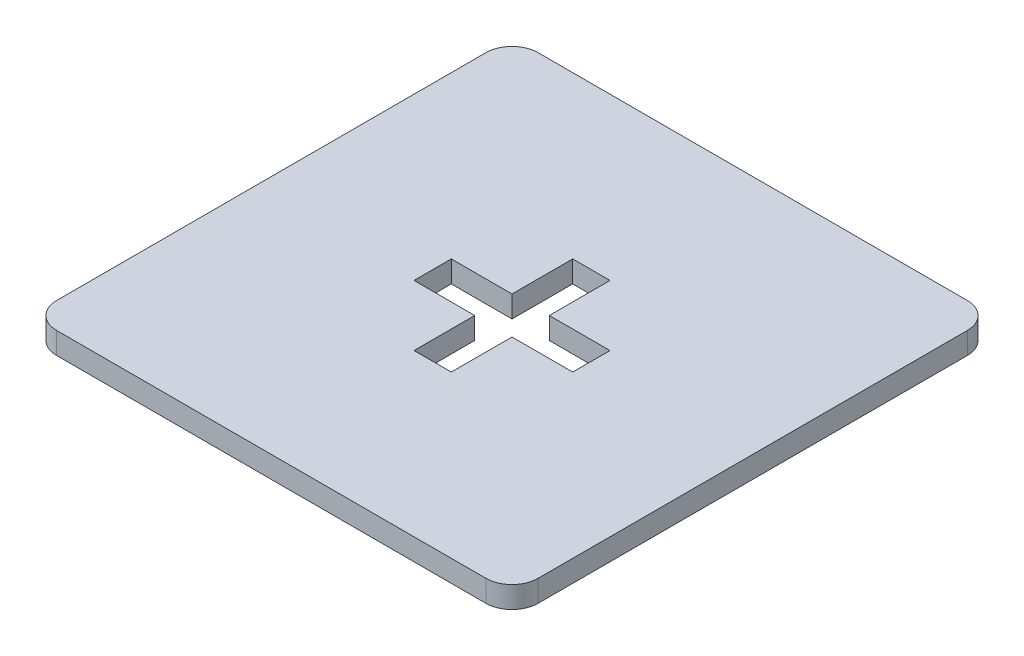
ISO-10303-21;
HEADER;
FILE_DESCRIPTION(('STEP AP214'),'2;1');
FILE_NAME('part.step','',(''),(''),'','','');
FILE_SCHEMA(('AUTOMOTIVE_DESIGN { 1 0 10303 214 1 1 1 1 }'));
ENDSEC;
DATA;
#1=APPLICATION_CONTEXT('core data for automotive mechanical design processes');
#2=APPLICATION_PROTOCOL_DEFINITION('international standard','automotive_design',2000,#1);
#3=PRODUCT_CONTEXT('',#1,'mechanical');
#4=PRODUCT('Part','Part','',(#3));
#5=PRODUCT_RELATED_PRODUCT_CATEGORY('part','',(#4));
#6=PRODUCT_DEFINITION_FORMATION('','',#4);
#7=PRODUCT_DEFINITION_CONTEXT('part definition',#1,'design');
#8=PRODUCT_DEFINITION('design','',#6,#7);
#9=PRODUCT_DEFINITION_SHAPE('','',#8);
#10=(LENGTH_UNIT() NAMED_UNIT(*) SI_UNIT(.MILLI.,.METRE.));
#11=(NAMED_UNIT(*) PLANE_ANGLE_UNIT() SI_UNIT($,.RADIAN.));
#12=(NAMED_UNIT(*) SI_UNIT($,.STERADIAN.) SOLID_ANGLE_UNIT());
#13=UNCERTAINTY_MEASURE_WITH_UNIT(LENGTH_MEASURE(1.E-05),#10,'distance_accuracy_value','');
#14=(GEOMETRIC_REPRESENTATION_CONTEXT(3) GLOBAL_UNCERTAINTY_ASSIGNED_CONTEXT((#13)) GLOBAL_UNIT_ASSIGNED_CONTEXT((#10,
#11,#12)) REPRESENTATION_CONTEXT('',''));
#15=CARTESIAN_POINT('',(0.,0.,0.));
#16=DIRECTION('',(0.,0.,1.));
#17=DIRECTION('',(1.,0.,0.));
#18=AXIS2_PLACEMENT_3D('',#15,#16,#17);
#19=CARTESIAN_POINT('',(24.75,2.5,24.75));
#20=DIRECTION('',(0.,-1.,0.));
#21=DIRECTION('',(0.,0.,-1.));
#22=AXIS2_PLACEMENT_3D('',#19,#20,#21);
#23=CYLINDRICAL_SURFACE('',#22,3.);
#24=DIRECTION('',(0.,-1.,0.));
#25=VECTOR('',#24,1.);
#26=CARTESIAN_POINT('',(27.75,2.5,24.75));
#27=LINE('',#26,#25);
#28=CARTESIAN_POINT('',(27.75,2.5,24.75));
#29=VERTEX_POINT('',#28);
#30=CARTESIAN_POINT('',(27.75,0.,24.75));
#31=VERTEX_POINT('',#30);
#32=EDGE_CURVE('E319',#29,#31,#27,.T.);
#33=ORIENTED_EDGE('',*,*,#32,.F.);
#34=CARTESIAN_POINT('',(24.75,2.5,24.75));
#35=DIRECTION('',(0.,1.,0.));
#36=DIRECTION('',(0.,0.,1.));
#37=AXIS2_PLACEMENT_3D('',#34,#35,#36);
#38=CIRCLE('',#37,3.);
#39=CARTESIAN_POINT('',(24.75,2.5,27.75));
#40=VERTEX_POINT('',#39);
#41=EDGE_CURVE('E42',#40,#29,#38,.T.);
#42=ORIENTED_EDGE('',*,*,#41,.F.);
#43=DIRECTION('',(0.,-1.,0.));
#44=VECTOR('',#43,1.);
#45=CARTESIAN_POINT('',(24.75,2.5,27.75));
#46=LINE('',#45,#44);
#47=CARTESIAN_POINT('',(24.75,0.,27.75));
#48=VERTEX_POINT('',#47);
#49=EDGE_CURVE('E322',#48,#40,#46,.F.);
#50=ORIENTED_EDGE('',*,*,#49,.F.);
#51=CARTESIAN_POINT('',(24.75,0.,24.75));
#52=DIRECTION('',(0.,1.,0.));
#53=DIRECTION('',(0.,0.,1.));
#54=AXIS2_PLACEMENT_3D('',#51,#52,#53);
#55=CIRCLE('',#54,3.);
#56=EDGE_CURVE('E11',#31,#48,#55,.F.);
#57=ORIENTED_EDGE('',*,*,#56,.F.);
#58=EDGE_LOOP('',(#33,#42,#50,#57));
#59=FACE_BOUND('',#58,.T.);
#60=ADVANCED_FACE('F35',(#59),#23,.T.);
#61=CARTESIAN_POINT('',(-24.75,2.5,24.75));
#62=DIRECTION('',(0.,-1.,0.));
#63=DIRECTION('',(0.,0.,-1.));
#64=AXIS2_PLACEMENT_3D('',#61,#62,#63);
#65=CYLINDRICAL_SURFACE('',#64,3.);
#66=DIRECTION('',(0.,-1.,0.));
#67=VECTOR('',#66,1.);
#68=CARTESIAN_POINT('',(-24.75,2.5,27.75));
#69=LINE('',#68,#67);
#70=CARTESIAN_POINT('',(-24.75,2.5,27.75));
#71=VERTEX_POINT('',#70);
#72=CARTESIAN_POINT('',(-24.75,0.,27.75));
#73=VERTEX_POINT('',#72);
#74=EDGE_CURVE('E309',#71,#73,#69,.T.);
#75=ORIENTED_EDGE('',*,*,#74,.F.);
#76=CARTESIAN_POINT('',(-24.75,2.5,24.75));
#77=DIRECTION('',(0.,1.,0.));
#78=DIRECTION('',(0.,0.,1.));
#79=AXIS2_PLACEMENT_3D('',#76,#77,#78);
#80=CIRCLE('',#79,3.);
#81=CARTESIAN_POINT('',(-27.75,2.5,24.75));
#82=VERTEX_POINT('',#81);
#83=EDGE_CURVE('E315',#82,#71,#80,.T.);
#84=ORIENTED_EDGE('',*,*,#83,.F.);
#85=DIRECTION('',(0.,-1.,0.));
#86=VECTOR('',#85,1.);
#87=CARTESIAN_POINT('',(-27.75,2.5,24.75));
#88=LINE('',#87,#86);
#89=CARTESIAN_POINT('',(-27.75,0.,24.75));
#90=VERTEX_POINT('',#89);
#91=EDGE_CURVE('E312',#90,#82,#88,.F.);
#92=ORIENTED_EDGE('',*,*,#91,.F.);
#93=CARTESIAN_POINT('',(-24.75,0.,24.75));
#94=DIRECTION('',(0.,1.,0.));
#95=DIRECTION('',(0.,0.,1.));
#96=AXIS2_PLACEMENT_3D('',#93,#94,#95);
#97=CIRCLE('',#96,3.);
#98=EDGE_CURVE('E317',#73,#90,#97,.F.);
#99=ORIENTED_EDGE('',*,*,#98,.F.);
#100=EDGE_LOOP('',(#75,#84,#92,#99));
#101=FACE_BOUND('',#100,.T.);
#102=ADVANCED_FACE('F354',(#101),#65,.T.);
#103=CARTESIAN_POINT('',(-24.75,2.5,-24.75));
#104=DIRECTION('',(0.,-1.,0.));
#105=DIRECTION('',(0.,0.,-1.));
#106=AXIS2_PLACEMENT_3D('',#103,#104,#105);
#107=CYLINDRICAL_SURFACE('',#106,3.);
#108=DIRECTION('',(0.,-1.,0.));
#109=VECTOR('',#108,1.);
#110=CARTESIAN_POINT('',(-27.75,2.5,-24.75));
#111=LINE('',#110,#109);
#112=CARTESIAN_POINT('',(-27.75,2.5,-24.75));
#113=VERTEX_POINT('',#112);
#114=CARTESIAN_POINT('',(-27.75,0.,-24.75));
#115=VERTEX_POINT('',#114);
#116=EDGE_CURVE('E299',#113,#115,#111,.T.);
#117=ORIENTED_EDGE('',*,*,#116,.F.);
#118=CARTESIAN_POINT('',(-24.75,2.5,-24.75));
#119=DIRECTION('',(0.,1.,0.));
#120=DIRECTION('',(0.,0.,1.));
#121=AXIS2_PLACEMENT_3D('',#118,#119,#120);
#122=CIRCLE('',#121,3.);
#123=CARTESIAN_POINT('',(-24.75,2.5,-27.75));
#124=VERTEX_POINT('',#123);
#125=EDGE_CURVE('E305',#124,#113,#122,.T.);
#126=ORIENTED_EDGE('',*,*,#125,.F.);
#127=DIRECTION('',(0.,-1.,0.));
#128=VECTOR('',#127,1.);
#129=CARTESIAN_POINT('',(-24.75,2.5,-27.75));
#130=LINE('',#129,#128);
#131=CARTESIAN_POINT('',(-24.75,0.,-27.75));
#132=VERTEX_POINT('',#131);
#133=EDGE_CURVE('E302',#132,#124,#130,.F.);
#134=ORIENTED_EDGE('',*,*,#133,.F.);
#135=CARTESIAN_POINT('',(-24.75,0.,-24.75));
#136=DIRECTION('',(0.,1.,0.));
#137=DIRECTION('',(0.,0.,1.));
#138=AXIS2_PLACEMENT_3D('',#135,#136,#137);
#139=CIRCLE('',#138,3.);
#140=EDGE_CURVE('E307',#115,#132,#139,.F.);
#141=ORIENTED_EDGE('',*,*,#140,.F.);
#142=EDGE_LOOP('',(#117,#126,#134,#141));
#143=FACE_BOUND('',#142,.T.);
#144=ADVANCED_FACE('F346',(#143),#107,.T.);
#145=CARTESIAN_POINT('',(24.75,2.5,-24.75));
#146=DIRECTION('',(0.,1.,0.));
#147=DIRECTION('',(0.,0.,1.));
#148=AXIS2_PLACEMENT_3D('',#145,#146,#147);
#149=CYLINDRICAL_SURFACE('',#148,3.);
#150=DIRECTION('',(0.,1.,0.));
#151=VECTOR('',#150,1.);
#152=CARTESIAN_POINT('',(27.75,2.5,-24.75));
#153=LINE('',#152,#151);
#154=CARTESIAN_POINT('',(27.75,0.,-24.75));
#155=VERTEX_POINT('',#154);
#156=CARTESIAN_POINT('',(27.75,2.5,-24.75));
#157=VERTEX_POINT('',#156);
#158=EDGE_CURVE('E279',#155,#157,#153,.T.);
#159=ORIENTED_EDGE('',*,*,#158,.F.);
#160=CARTESIAN_POINT('',(24.75,0.,-24.75));
#161=DIRECTION('',(0.,1.,0.));
#162=DIRECTION('',(0.,0.,1.));
#163=AXIS2_PLACEMENT_3D('',#160,#161,#162);
#164=CIRCLE('',#163,3.);
#165=CARTESIAN_POINT('',(24.75,0.,-27.75));
#166=VERTEX_POINT('',#165);
#167=EDGE_CURVE('E294',#166,#155,#164,.F.);
#168=ORIENTED_EDGE('',*,*,#167,.F.);
#169=DIRECTION('',(0.,1.,0.));
#170=VECTOR('',#169,1.);
#171=CARTESIAN_POINT('',(24.75,2.5,-27.75));
#172=LINE('',#171,#170);
#173=CARTESIAN_POINT('',(24.75,2.5,-27.75));
#174=VERTEX_POINT('',#173);
#175=EDGE_CURVE('E291',#174,#166,#172,.F.);
#176=ORIENTED_EDGE('',*,*,#175,.F.);
#177=CARTESIAN_POINT('',(24.75,2.5,-24.75));
#178=DIRECTION('',(0.,1.,0.));
#179=DIRECTION('',(0.,0.,1.));
#180=AXIS2_PLACEMENT_3D('',#177,#178,#179);
#181=CIRCLE('',#180,3.);
#182=EDGE_CURVE('E297',#157,#174,#181,.T.);
#183=ORIENTED_EDGE('',*,*,#182,.F.);
#184=EDGE_LOOP('',(#159,#168,#176,#183));
#185=FACE_BOUND('',#184,.T.);
#186=ADVANCED_FACE('F337',(#185),#149,.T.);
#187=CARTESIAN_POINT('',(27.75,2.5,-27.75));
#188=DIRECTION('',(-1.,0.,0.));
#189=DIRECTION('',(0.,0.,1.));
#190=AXIS2_PLACEMENT_3D('',#187,#188,#189);
#191=PLANE('',#190);
#192=DIRECTION('',(0.,0.,-1.));
#193=VECTOR('',#192,1.);
#194=CARTESIAN_POINT('',(27.75,2.5,-27.75));
#195=LINE('',#194,#193);
#196=EDGE_CURVE('E267',#29,#157,#195,.T.);
#197=ORIENTED_EDGE('',*,*,#196,.F.);
#198=ORIENTED_EDGE('',*,*,#32,.T.);
#199=DIRECTION('',(0.,0.,-1.));
#200=VECTOR('',#199,1.);
#201=CARTESIAN_POINT('',(27.75,0.,-27.75));
#202=LINE('',#201,#200);
#203=EDGE_CURVE('E247',#31,#155,#202,.T.);
#204=ORIENTED_EDGE('',*,*,#203,.T.);
#205=ORIENTED_EDGE('',*,*,#158,.T.);
#206=EDGE_LOOP('',(#197,#198,#204,#205));
#207=FACE_BOUND('',#206,.T.);
#208=ADVANCED_FACE('F334',(#207),#191,.F.);
#209=CARTESIAN_POINT('',(-27.75,2.5,-27.75));
#210=DIRECTION('',(0.,0.,1.));
#211=DIRECTION('',(1.,0.,0.));
#212=AXIS2_PLACEMENT_3D('',#209,#210,#211);
#213=PLANE('',#212);
#214=DIRECTION('',(-1.,0.,0.));
#215=VECTOR('',#214,1.);
#216=CARTESIAN_POINT('',(-27.75,0.,-27.75));
#217=LINE('',#216,#215);
#218=EDGE_CURVE('E281',#166,#132,#217,.T.);
#219=ORIENTED_EDGE('',*,*,#218,.T.);
#220=ORIENTED_EDGE('',*,*,#133,.T.);
#221=DIRECTION('',(-1.,0.,0.));
#222=VECTOR('',#221,1.);
#223=CARTESIAN_POINT('',(-27.75,2.5,-27.75));
#224=LINE('',#223,#222);
#225=EDGE_CURVE('E269',#174,#124,#224,.T.);
#226=ORIENTED_EDGE('',*,*,#225,.F.);
#227=ORIENTED_EDGE('',*,*,#175,.T.);
#228=EDGE_LOOP('',(#219,#220,#226,#227));
#229=FACE_BOUND('',#228,.T.);
#230=ADVANCED_FACE('F342',(#229),#213,.F.);
#231=CARTESIAN_POINT('',(-27.75,2.5,-27.75));
#232=DIRECTION('',(1.,0.,0.));
#233=DIRECTION('',(0.,0.,-1.));
#234=AXIS2_PLACEMENT_3D('',#231,#232,#233);
#235=PLANE('',#234);
#236=DIRECTION('',(0.,0.,1.));
#237=VECTOR('',#236,1.);
#238=CARTESIAN_POINT('',(-27.75,0.,-27.75));
#239=LINE('',#238,#237);
#240=EDGE_CURVE('E284',#115,#90,#239,.T.);
#241=ORIENTED_EDGE('',*,*,#240,.T.);
#242=ORIENTED_EDGE('',*,*,#91,.T.);
#243=DIRECTION('',(0.,0.,1.));
#244=VECTOR('',#243,1.);
#245=CARTESIAN_POINT('',(-27.75,2.5,-27.75));
#246=LINE('',#245,#244);
#247=EDGE_CURVE('E273',#113,#82,#246,.T.);
#248=ORIENTED_EDGE('',*,*,#247,.F.);
#249=ORIENTED_EDGE('',*,*,#116,.T.);
#250=EDGE_LOOP('',(#241,#242,#248,#249));
#251=FACE_BOUND('',#250,.T.);
#252=ADVANCED_FACE('F350',(#251),#235,.F.);
#253=CARTESIAN_POINT('',(-27.75,2.5,27.75));
#254=DIRECTION('',(0.,0.,-1.));
#255=DIRECTION('',(-1.,0.,0.));
#256=AXIS2_PLACEMENT_3D('',#253,#254,#255);
#257=PLANE('',#256);
#258=DIRECTION('',(1.,0.,0.));
#259=VECTOR('',#258,1.);
#260=CARTESIAN_POINT('',(-27.75,0.,27.75));
#261=LINE('',#260,#259);
#262=EDGE_CURVE('E270',#73,#48,#261,.T.);
#263=ORIENTED_EDGE('',*,*,#262,.T.);
#264=ORIENTED_EDGE('',*,*,#49,.T.);
#265=DIRECTION('',(1.,0.,0.));
#266=VECTOR('',#265,1.);
#267=CARTESIAN_POINT('',(-27.75,2.5,27.75));
#268=LINE('',#267,#266);
#269=EDGE_CURVE('E276',#71,#40,#268,.T.);
#270=ORIENTED_EDGE('',*,*,#269,.F.);
#271=ORIENTED_EDGE('',*,*,#74,.T.);
#272=EDGE_LOOP('',(#263,#264,#270,#271));
#273=FACE_BOUND('',#272,.T.);
#274=ADVANCED_FACE('F357',(#273),#257,.F.);
#275=CARTESIAN_POINT('',(0.,2.5,0.));
#276=DIRECTION('',(0.,1.,0.));
#277=DIRECTION('',(0.,0.,1.));
#278=AXIS2_PLACEMENT_3D('',#275,#276,#277);
#279=PLANE('',#278);
#280=DIRECTION('',(0.,0.,1.));
#281=VECTOR('',#280,1.);
#282=CARTESIAN_POINT('',(-2.15,2.5,0.));
#283=LINE('',#282,#281);
#284=CARTESIAN_POINT('',(-2.15,2.5,-9.15000000000001));
#285=VERTEX_POINT('',#284);
#286=CARTESIAN_POINT('',(-2.15,2.5,-2.15));
#287=VERTEX_POINT('',#286);
#288=EDGE_CURVE('E49',#285,#287,#283,.T.);
#289=ORIENTED_EDGE('',*,*,#288,.F.);
#290=DIRECTION('',(1.,0.,0.));
#291=VECTOR('',#290,1.);
#292=CARTESIAN_POINT('',(0.,2.5,-9.15000000000001));
#293=LINE('',#292,#291);
#294=CARTESIAN_POINT('',(2.15,2.5,-9.15000000000001));
#295=VERTEX_POINT('',#294);
#296=EDGE_CURVE('E188',#285,#295,#293,.T.);
#297=ORIENTED_EDGE('',*,*,#296,.T.);
#298=DIRECTION('',(0.,0.,1.));
#299=VECTOR('',#298,1.);
#300=CARTESIAN_POINT('',(2.15,2.5,0.));
#301=LINE('',#300,#299);
#302=CARTESIAN_POINT('',(2.15,2.5,-2.15));
#303=VERTEX_POINT('',#302);
#304=EDGE_CURVE('E191',#295,#303,#301,.T.);
#305=ORIENTED_EDGE('',*,*,#304,.T.);
#306=DIRECTION('',(1.,0.,0.));
#307=VECTOR('',#306,1.);
#308=CARTESIAN_POINT('',(0.,2.5,-2.15));
#309=LINE('',#308,#307);
#310=CARTESIAN_POINT('',(9.15,2.5,-2.15));
#311=VERTEX_POINT('',#310);
#312=EDGE_CURVE('E240',#303,#311,#309,.T.);
#313=ORIENTED_EDGE('',*,*,#312,.T.);
#314=DIRECTION('',(0.,0.,1.));
#315=VECTOR('',#314,1.);
#316=CARTESIAN_POINT('',(9.15,2.5,0.));
#317=LINE('',#316,#315);
#318=CARTESIAN_POINT('',(9.15,2.5,2.15));
#319=VERTEX_POINT('',#318);
#320=EDGE_CURVE('E237',#311,#319,#317,.T.);
#321=ORIENTED_EDGE('',*,*,#320,.T.);
#322=DIRECTION('',(1.,0.,0.));
#323=VECTOR('',#322,1.);
#324=CARTESIAN_POINT('',(0.,2.5,2.15));
#325=LINE('',#324,#323);
#326=CARTESIAN_POINT('',(2.15,2.5,2.15));
#327=VERTEX_POINT('',#326);
#328=EDGE_CURVE('E234',#327,#319,#325,.T.);
#329=ORIENTED_EDGE('',*,*,#328,.F.);
#330=DIRECTION('',(0.,0.,1.));
#331=VECTOR('',#330,1.);
#332=CARTESIAN_POINT('',(2.15,2.5,0.));
#333=LINE('',#332,#331);
#334=CARTESIAN_POINT('',(2.15,2.5,9.15));
#335=VERTEX_POINT('',#334);
#336=EDGE_CURVE('E231',#327,#335,#333,.T.);
#337=ORIENTED_EDGE('',*,*,#336,.T.);
#338=DIRECTION('',(1.,0.,0.));
#339=VECTOR('',#338,1.);
#340=CARTESIAN_POINT('',(0.,2.5,9.15));
#341=LINE('',#340,#339);
#342=CARTESIAN_POINT('',(-2.15,2.5,9.15));
#343=VERTEX_POINT('',#342);
#344=EDGE_CURVE('E228',#343,#335,#341,.T.);
#345=ORIENTED_EDGE('',*,*,#344,.F.);
#346=DIRECTION('',(0.,0.,1.));
#347=VECTOR('',#346,1.);
#348=CARTESIAN_POINT('',(-2.15,2.5,0.));
#349=LINE('',#348,#347);
#350=CARTESIAN_POINT('',(-2.15,2.5,2.15));
#351=VERTEX_POINT('',#350);
#352=EDGE_CURVE('E225',#351,#343,#349,.T.);
#353=ORIENTED_EDGE('',*,*,#352,.F.);
#354=DIRECTION('',(1.,0.,0.));
#355=VECTOR('',#354,1.);
#356=CARTESIAN_POINT('',(0.,2.5,2.15));
#357=LINE('',#356,#355);
#358=CARTESIAN_POINT('',(-9.15,2.5,2.15));
#359=VERTEX_POINT('',#358);
#360=EDGE_CURVE('E222',#359,#351,#357,.T.);
#361=ORIENTED_EDGE('',*,*,#360,.F.);
#362=DIRECTION('',(0.,0.,1.));
#363=VECTOR('',#362,1.);
#364=CARTESIAN_POINT('',(-9.15,2.5,0.));
#365=LINE('',#364,#363);
#366=CARTESIAN_POINT('',(-9.15,2.5,-2.15));
#367=VERTEX_POINT('',#366);
#368=EDGE_CURVE('E219',#367,#359,#365,.T.);
#369=ORIENTED_EDGE('',*,*,#368,.F.);
#370=DIRECTION('',(1.,0.,0.));
#371=VECTOR('',#370,1.);
#372=CARTESIAN_POINT('',(0.,2.5,-2.15));
#373=LINE('',#372,#371);
#374=EDGE_CURVE('E217',#367,#287,#373,.T.);
#375=ORIENTED_EDGE('',*,*,#374,.T.);
#376=EDGE_LOOP('',(#289,#297,#305,#313,#321,#329,#337,#345,#353,#361,#369,#375));
#377=FACE_BOUND('',#376,.T.);
#378=ORIENTED_EDGE('',*,*,#269,.T.);
#379=ORIENTED_EDGE('',*,*,#41,.T.);
#380=ORIENTED_EDGE('',*,*,#196,.T.);
#381=ORIENTED_EDGE('',*,*,#182,.T.);
#382=ORIENTED_EDGE('',*,*,#225,.T.);
#383=ORIENTED_EDGE('',*,*,#125,.T.);
#384=ORIENTED_EDGE('',*,*,#247,.T.);
#385=ORIENTED_EDGE('',*,*,#83,.T.);
#386=EDGE_LOOP('',(#378,#379,#380,#381,#382,#383,#384,#385));
#387=FACE_BOUND('',#386,.T.);
#388=ADVANCED_FACE('F326',(#377,#387),#279,.T.);
#389=CARTESIAN_POINT('',(0.,0.,0.));
#390=DIRECTION('',(0.,1.,0.));
#391=DIRECTION('',(0.,0.,1.));
#392=AXIS2_PLACEMENT_3D('',#389,#390,#391);
#393=PLANE('',#392);
#394=DIRECTION('',(1.,0.,0.));
#395=VECTOR('',#394,1.);
#396=CARTESIAN_POINT('',(0.,0.,-9.15000000000001));
#397=LINE('',#396,#395);
#398=CARTESIAN_POINT('',(-2.15,0.,-9.15000000000001));
#399=VERTEX_POINT('',#398);
#400=CARTESIAN_POINT('',(2.15,0.,-9.15000000000001));
#401=VERTEX_POINT('',#400);
#402=EDGE_CURVE('E183',#399,#401,#397,.T.);
#403=ORIENTED_EDGE('',*,*,#402,.F.);
#404=DIRECTION('',(0.,0.,1.));
#405=VECTOR('',#404,1.);
#406=CARTESIAN_POINT('',(-2.15,0.,0.));
#407=LINE('',#406,#405);
#408=CARTESIAN_POINT('',(-2.15,0.,-2.15));
#409=VERTEX_POINT('',#408);
#410=EDGE_CURVE('E178',#399,#409,#407,.T.);
#411=ORIENTED_EDGE('',*,*,#410,.T.);
#412=DIRECTION('',(1.,0.,0.));
#413=VECTOR('',#412,1.);
#414=CARTESIAN_POINT('',(0.,0.,-2.15));
#415=LINE('',#414,#413);
#416=CARTESIAN_POINT('',(-9.15,0.,-2.15));
#417=VERTEX_POINT('',#416);
#418=EDGE_CURVE('E170',#417,#409,#415,.T.);
#419=ORIENTED_EDGE('',*,*,#418,.F.);
#420=DIRECTION('',(0.,0.,1.));
#421=VECTOR('',#420,1.);
#422=CARTESIAN_POINT('',(-9.15,0.,0.));
#423=LINE('',#422,#421);
#424=CARTESIAN_POINT('',(-9.15,0.,2.15));
#425=VERTEX_POINT('',#424);
#426=EDGE_CURVE('E57',#417,#425,#423,.T.);
#427=ORIENTED_EDGE('',*,*,#426,.T.);
#428=DIRECTION('',(1.,0.,0.));
#429=VECTOR('',#428,1.);
#430=CARTESIAN_POINT('',(0.,0.,2.15));
#431=LINE('',#430,#429);
#432=CARTESIAN_POINT('',(-2.15,0.,2.15));
#433=VERTEX_POINT('',#432);
#434=EDGE_CURVE('E195',#425,#433,#431,.T.);
#435=ORIENTED_EDGE('',*,*,#434,.T.);
#436=DIRECTION('',(0.,0.,1.));
#437=VECTOR('',#436,1.);
#438=CARTESIAN_POINT('',(-2.15,0.,0.));
#439=LINE('',#438,#437);
#440=CARTESIAN_POINT('',(-2.15,0.,9.15));
#441=VERTEX_POINT('',#440);
#442=EDGE_CURVE('E198',#433,#441,#439,.T.);
#443=ORIENTED_EDGE('',*,*,#442,.T.);
#444=DIRECTION('',(1.,0.,0.));
#445=VECTOR('',#444,1.);
#446=CARTESIAN_POINT('',(0.,0.,9.15));
#447=LINE('',#446,#445);
#448=CARTESIAN_POINT('',(2.15,0.,9.15));
#449=VERTEX_POINT('',#448);
#450=EDGE_CURVE('E201',#441,#449,#447,.T.);
#451=ORIENTED_EDGE('',*,*,#450,.T.);
#452=DIRECTION('',(0.,0.,1.));
#453=VECTOR('',#452,1.);
#454=CARTESIAN_POINT('',(2.15,0.,0.));
#455=LINE('',#454,#453);
#456=CARTESIAN_POINT('',(2.15,0.,2.15));
#457=VERTEX_POINT('',#456);
#458=EDGE_CURVE('E204',#457,#449,#455,.T.);
#459=ORIENTED_EDGE('',*,*,#458,.F.);
#460=DIRECTION('',(1.,0.,0.));
#461=VECTOR('',#460,1.);
#462=CARTESIAN_POINT('',(0.,0.,2.15));
#463=LINE('',#462,#461);
#464=CARTESIAN_POINT('',(9.15,0.,2.15));
#465=VERTEX_POINT('',#464);
#466=EDGE_CURVE('E206',#457,#465,#463,.T.);
#467=ORIENTED_EDGE('',*,*,#466,.T.);
#468=DIRECTION('',(0.,0.,1.));
#469=VECTOR('',#468,1.);
#470=CARTESIAN_POINT('',(9.15,0.,0.));
#471=LINE('',#470,#469);
#472=CARTESIAN_POINT('',(9.15,0.,-2.15));
#473=VERTEX_POINT('',#472);
#474=EDGE_CURVE('E209',#473,#465,#471,.T.);
#475=ORIENTED_EDGE('',*,*,#474,.F.);
#476=DIRECTION('',(1.,0.,0.));
#477=VECTOR('',#476,1.);
#478=CARTESIAN_POINT('',(0.,0.,-2.15));
#479=LINE('',#478,#477);
#480=CARTESIAN_POINT('',(2.15,0.,-2.15));
#481=VERTEX_POINT('',#480);
#482=EDGE_CURVE('E211',#481,#473,#479,.T.);
#483=ORIENTED_EDGE('',*,*,#482,.F.);
#484=DIRECTION('',(0.,0.,1.));
#485=VECTOR('',#484,1.);
#486=CARTESIAN_POINT('',(2.15,0.,0.));
#487=LINE('',#486,#485);
#488=EDGE_CURVE('E213',#401,#481,#487,.T.);
#489=ORIENTED_EDGE('',*,*,#488,.F.);
#490=EDGE_LOOP('',(#403,#411,#419,#427,#435,#443,#451,#459,#467,#475,#483,#489));
#491=FACE_BOUND('',#490,.T.);
#492=ORIENTED_EDGE('',*,*,#203,.F.);
#493=ORIENTED_EDGE('',*,*,#56,.T.);
#494=ORIENTED_EDGE('',*,*,#262,.F.);
#495=ORIENTED_EDGE('',*,*,#98,.T.);
#496=ORIENTED_EDGE('',*,*,#240,.F.);
#497=ORIENTED_EDGE('',*,*,#140,.T.);
#498=ORIENTED_EDGE('',*,*,#218,.F.);
#499=ORIENTED_EDGE('',*,*,#167,.T.);
#500=EDGE_LOOP('',(#492,#493,#494,#495,#496,#497,#498,#499));
#501=FACE_BOUND('',#500,.T.);
#502=ADVANCED_FACE('F185',(#491,#501),#393,.F.);
#503=CARTESIAN_POINT('',(-2.15,0.,0.));
#504=DIRECTION('',(-1.,0.,0.));
#505=DIRECTION('',(0.,0.,1.));
#506=AXIS2_PLACEMENT_3D('',#503,#504,#505);
#507=PLANE('',#506);
#508=ORIENTED_EDGE('',*,*,#288,.T.);
#509=DIRECTION('',(0.,1.,0.));
#510=VECTOR('',#509,1.);
#511=CARTESIAN_POINT('',(-2.15,0.,-2.15));
#512=LINE('',#511,#510);
#513=EDGE_CURVE('E173',#409,#287,#512,.T.);
#514=ORIENTED_EDGE('',*,*,#513,.F.);
#515=ORIENTED_EDGE('',*,*,#410,.F.);
#516=DIRECTION('',(0.,1.,0.));
#517=VECTOR('',#516,1.);
#518=CARTESIAN_POINT('',(-2.15,0.,-9.15000000000001));
#519=LINE('',#518,#517);
#520=EDGE_CURVE('E245',#399,#285,#519,.T.);
#521=ORIENTED_EDGE('',*,*,#520,.T.);
#522=EDGE_LOOP('',(#508,#514,#515,#521));
#523=FACE_BOUND('',#522,.T.);
#524=ADVANCED_FACE('F181',(#523),#507,.F.);
#525=CARTESIAN_POINT('',(0.,0.,-9.15000000000001));
#526=DIRECTION('',(0.,0.,1.));
#527=DIRECTION('',(1.,0.,0.));
#528=AXIS2_PLACEMENT_3D('',#525,#526,#527);
#529=PLANE('',#528);
#530=ORIENTED_EDGE('',*,*,#296,.F.);
#531=ORIENTED_EDGE('',*,*,#520,.F.);
#532=ORIENTED_EDGE('',*,*,#402,.T.);
#533=DIRECTION('',(0.,1.,0.));
#534=VECTOR('',#533,1.);
#535=CARTESIAN_POINT('',(2.15,0.,-9.15000000000001));
#536=LINE('',#535,#534);
#537=EDGE_CURVE('E248',#401,#295,#536,.T.);
#538=ORIENTED_EDGE('',*,*,#537,.T.);
#539=EDGE_LOOP('',(#530,#531,#532,#538));
#540=FACE_BOUND('',#539,.T.);
#541=ADVANCED_FACE('F364',(#540),#529,.T.);
#542=CARTESIAN_POINT('',(2.15,0.,0.));
#543=DIRECTION('',(-1.,0.,0.));
#544=DIRECTION('',(0.,0.,1.));
#545=AXIS2_PLACEMENT_3D('',#542,#543,#544);
#546=PLANE('',#545);
#547=ORIENTED_EDGE('',*,*,#304,.F.);
#548=ORIENTED_EDGE('',*,*,#537,.F.);
#549=ORIENTED_EDGE('',*,*,#488,.T.);
#550=DIRECTION('',(0.,1.,0.));
#551=VECTOR('',#550,1.);
#552=CARTESIAN_POINT('',(2.15,0.,-2.15));
#553=LINE('',#552,#551);
#554=EDGE_CURVE('E250',#481,#303,#553,.T.);
#555=ORIENTED_EDGE('',*,*,#554,.T.);
#556=EDGE_LOOP('',(#547,#548,#549,#555));
#557=FACE_BOUND('',#556,.T.);
#558=ADVANCED_FACE('F416',(#557),#546,.T.);
#559=CARTESIAN_POINT('',(0.,0.,-2.15));
#560=DIRECTION('',(0.,0.,1.));
#561=DIRECTION('',(1.,0.,0.));
#562=AXIS2_PLACEMENT_3D('',#559,#560,#561);
#563=PLANE('',#562);
#564=ORIENTED_EDGE('',*,*,#312,.F.);
#565=ORIENTED_EDGE('',*,*,#554,.F.);
#566=ORIENTED_EDGE('',*,*,#482,.T.);
#567=DIRECTION('',(0.,1.,0.));
#568=VECTOR('',#567,1.);
#569=CARTESIAN_POINT('',(9.15,0.,-2.15));
#570=LINE('',#569,#568);
#571=EDGE_CURVE('E252',#473,#311,#570,.T.);
#572=ORIENTED_EDGE('',*,*,#571,.T.);
#573=EDGE_LOOP('',(#564,#565,#566,#572));
#574=FACE_BOUND('',#573,.T.);
#575=ADVANCED_FACE('F426',(#574),#563,.T.);
#576=CARTESIAN_POINT('',(9.15,0.,0.));
#577=DIRECTION('',(-1.,0.,0.));
#578=DIRECTION('',(0.,0.,1.));
#579=AXIS2_PLACEMENT_3D('',#576,#577,#578);
#580=PLANE('',#579);
#581=ORIENTED_EDGE('',*,*,#320,.F.);
#582=ORIENTED_EDGE('',*,*,#571,.F.);
#583=ORIENTED_EDGE('',*,*,#474,.T.);
#584=DIRECTION('',(0.,1.,0.));
#585=VECTOR('',#584,1.);
#586=CARTESIAN_POINT('',(9.15,0.,2.15));
#587=LINE('',#586,#585);
#588=EDGE_CURVE('E254',#465,#319,#587,.T.);
#589=ORIENTED_EDGE('',*,*,#588,.T.);
#590=EDGE_LOOP('',(#581,#582,#583,#589));
#591=FACE_BOUND('',#590,.T.);
#592=ADVANCED_FACE('F436',(#591),#580,.T.);
#593=CARTESIAN_POINT('',(0.,0.,2.15));
#594=DIRECTION('',(0.,0.,1.));
#595=DIRECTION('',(1.,0.,0.));
#596=AXIS2_PLACEMENT_3D('',#593,#594,#595);
#597=PLANE('',#596);
#598=ORIENTED_EDGE('',*,*,#328,.T.);
#599=ORIENTED_EDGE('',*,*,#588,.F.);
#600=ORIENTED_EDGE('',*,*,#466,.F.);
#601=DIRECTION('',(0.,1.,0.));
#602=VECTOR('',#601,1.);
#603=CARTESIAN_POINT('',(2.15,0.,2.15));
#604=LINE('',#603,#602);
#605=EDGE_CURVE('E256',#457,#327,#604,.T.);
#606=ORIENTED_EDGE('',*,*,#605,.T.);
#607=EDGE_LOOP('',(#598,#599,#600,#606));
#608=FACE_BOUND('',#607,.T.);
#609=ADVANCED_FACE('F446',(#608),#597,.F.);
#610=CARTESIAN_POINT('',(2.15,0.,0.));
#611=DIRECTION('',(-1.,0.,0.));
#612=DIRECTION('',(0.,0.,1.));
#613=AXIS2_PLACEMENT_3D('',#610,#611,#612);
#614=PLANE('',#613);
#615=ORIENTED_EDGE('',*,*,#336,.F.);
#616=ORIENTED_EDGE('',*,*,#605,.F.);
#617=ORIENTED_EDGE('',*,*,#458,.T.);
#618=DIRECTION('',(0.,1.,0.));
#619=VECTOR('',#618,1.);
#620=CARTESIAN_POINT('',(2.15,0.,9.15));
#621=LINE('',#620,#619);
#622=EDGE_CURVE('E258',#449,#335,#621,.T.);
#623=ORIENTED_EDGE('',*,*,#622,.T.);
#624=EDGE_LOOP('',(#615,#616,#617,#623));
#625=FACE_BOUND('',#624,.T.);
#626=ADVANCED_FACE('F456',(#625),#614,.T.);
#627=CARTESIAN_POINT('',(0.,0.,9.15));
#628=DIRECTION('',(0.,0.,1.));
#629=DIRECTION('',(1.,0.,0.));
#630=AXIS2_PLACEMENT_3D('',#627,#628,#629);
#631=PLANE('',#630);
#632=ORIENTED_EDGE('',*,*,#344,.T.);
#633=ORIENTED_EDGE('',*,*,#622,.F.);
#634=ORIENTED_EDGE('',*,*,#450,.F.);
#635=DIRECTION('',(0.,1.,0.));
#636=VECTOR('',#635,1.);
#637=CARTESIAN_POINT('',(-2.15,0.,9.15));
#638=LINE('',#637,#636);
#639=EDGE_CURVE('E260',#441,#343,#638,.T.);
#640=ORIENTED_EDGE('',*,*,#639,.T.);
#641=EDGE_LOOP('',(#632,#633,#634,#640));
#642=FACE_BOUND('',#641,.T.);
#643=ADVANCED_FACE('F466',(#642),#631,.F.);
#644=CARTESIAN_POINT('',(-2.15,0.,0.));
#645=DIRECTION('',(-1.,0.,0.));
#646=DIRECTION('',(0.,0.,1.));
#647=AXIS2_PLACEMENT_3D('',#644,#645,#646);
#648=PLANE('',#647);
#649=ORIENTED_EDGE('',*,*,#352,.T.);
#650=ORIENTED_EDGE('',*,*,#639,.F.);
#651=ORIENTED_EDGE('',*,*,#442,.F.);
#652=DIRECTION('',(0.,1.,0.));
#653=VECTOR('',#652,1.);
#654=CARTESIAN_POINT('',(-2.15,0.,2.15));
#655=LINE('',#654,#653);
#656=EDGE_CURVE('E262',#433,#351,#655,.T.);
#657=ORIENTED_EDGE('',*,*,#656,.T.);
#658=EDGE_LOOP('',(#649,#650,#651,#657));
#659=FACE_BOUND('',#658,.T.);
#660=ADVANCED_FACE('F476',(#659),#648,.F.);
#661=CARTESIAN_POINT('',(0.,0.,2.15));
#662=DIRECTION('',(0.,0.,1.));
#663=DIRECTION('',(1.,0.,0.));
#664=AXIS2_PLACEMENT_3D('',#661,#662,#663);
#665=PLANE('',#664);
#666=ORIENTED_EDGE('',*,*,#360,.T.);
#667=ORIENTED_EDGE('',*,*,#656,.F.);
#668=ORIENTED_EDGE('',*,*,#434,.F.);
#669=DIRECTION('',(0.,1.,0.));
#670=VECTOR('',#669,1.);
#671=CARTESIAN_POINT('',(-9.15,0.,2.15));
#672=LINE('',#671,#670);
#673=EDGE_CURVE('E264',#425,#359,#672,.T.);
#674=ORIENTED_EDGE('',*,*,#673,.T.);
#675=EDGE_LOOP('',(#666,#667,#668,#674));
#676=FACE_BOUND('',#675,.T.);
#677=ADVANCED_FACE('F486',(#676),#665,.F.);
#678=CARTESIAN_POINT('',(-9.15,0.,0.));
#679=DIRECTION('',(-1.,0.,0.));
#680=DIRECTION('',(0.,0.,1.));
#681=AXIS2_PLACEMENT_3D('',#678,#679,#680);
#682=PLANE('',#681);
#683=ORIENTED_EDGE('',*,*,#368,.T.);
#684=ORIENTED_EDGE('',*,*,#673,.F.);
#685=ORIENTED_EDGE('',*,*,#426,.F.);
#686=DIRECTION('',(0.,1.,0.));
#687=VECTOR('',#686,1.);
#688=CARTESIAN_POINT('',(-9.15,0.,-2.15));
#689=LINE('',#688,#687);
#690=EDGE_CURVE('E175',#417,#367,#689,.T.);
#691=ORIENTED_EDGE('',*,*,#690,.T.);
#692=EDGE_LOOP('',(#683,#684,#685,#691));
#693=FACE_BOUND('',#692,.T.);
#694=ADVANCED_FACE('F496',(#693),#682,.F.);
#695=CARTESIAN_POINT('',(0.,0.,-2.15));
#696=DIRECTION('',(0.,0.,1.));
#697=DIRECTION('',(1.,0.,0.));
#698=AXIS2_PLACEMENT_3D('',#695,#696,#697);
#699=PLANE('',#698);
#700=ORIENTED_EDGE('',*,*,#374,.F.);
#701=ORIENTED_EDGE('',*,*,#690,.F.);
#702=ORIENTED_EDGE('',*,*,#418,.T.);
#703=ORIENTED_EDGE('',*,*,#513,.T.);
#704=EDGE_LOOP('',(#700,#701,#702,#703));
#705=FACE_BOUND('',#704,.T.);
#706=ADVANCED_FACE('F172',(#705),#699,.T.);
#707=CLOSED_SHELL('',(#60,#102,#144,#186,#208,#230,#252,#274,#388,#502,#524,#541,#558,#575,#592,
#609,#626,#643,#660,#677,#694,#706));
#708=MANIFOLD_SOLID_BREP('B2',#707);
#709=ADVANCED_BREP_SHAPE_REPRESENTATION('',(#18,#708),#14);
#710=SHAPE_DEFINITION_REPRESENTATION(#9,#709);
ENDSEC;
END-ISO-10303-21;
